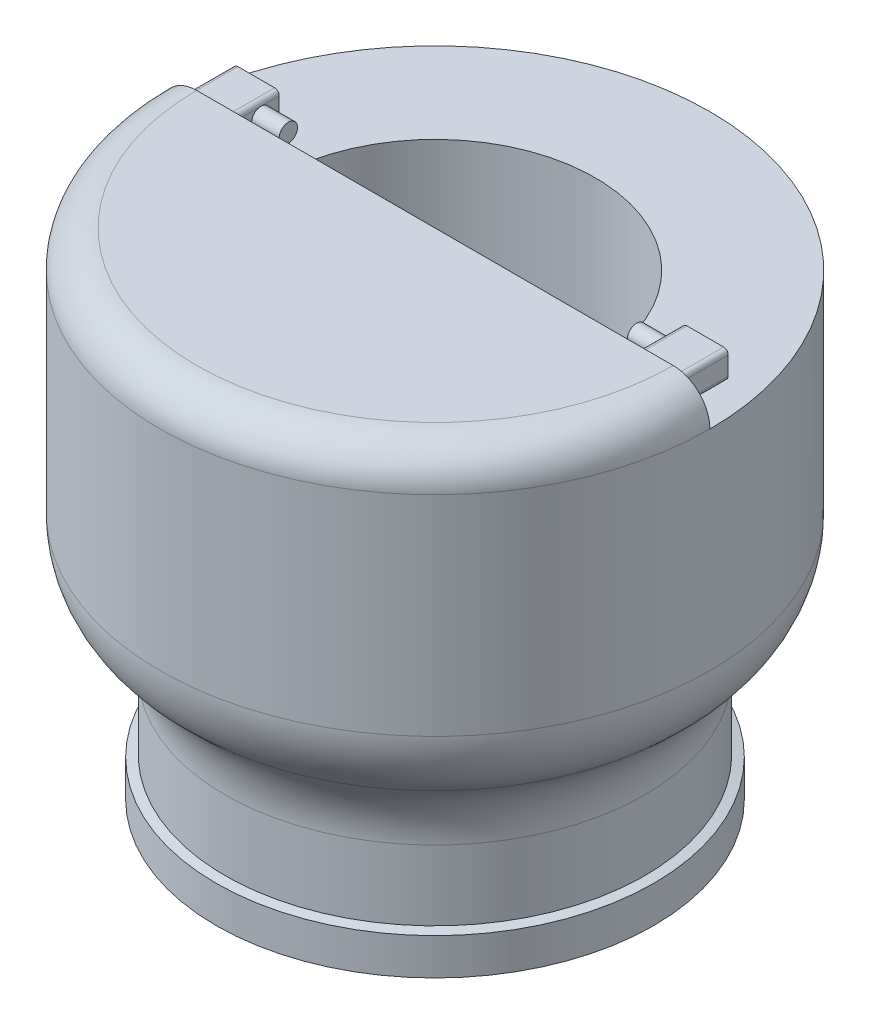
ISO-10303-21;
HEADER;
FILE_DESCRIPTION(('STEP AP214'),'2;1');
FILE_NAME('part.step','',(''),(''),'','','');
FILE_SCHEMA(('AUTOMOTIVE_DESIGN { 1 0 10303 214 1 1 1 1 }'));
ENDSEC;
DATA;
#1=APPLICATION_CONTEXT('core data for automotive mechanical design processes');
#2=APPLICATION_PROTOCOL_DEFINITION('international standard','automotive_design',2000,#1);
#3=PRODUCT_CONTEXT('',#1,'mechanical');
#4=PRODUCT('Part','Part','',(#3));
#5=PRODUCT_RELATED_PRODUCT_CATEGORY('part','',(#4));
#6=PRODUCT_DEFINITION_FORMATION('','',#4);
#7=PRODUCT_DEFINITION_CONTEXT('part definition',#1,'design');
#8=PRODUCT_DEFINITION('design','',#6,#7);
#9=PRODUCT_DEFINITION_SHAPE('','',#8);
#10=(LENGTH_UNIT() NAMED_UNIT(*) SI_UNIT(.MILLI.,.METRE.));
#11=(NAMED_UNIT(*) PLANE_ANGLE_UNIT() SI_UNIT($,.RADIAN.));
#12=(NAMED_UNIT(*) SI_UNIT($,.STERADIAN.) SOLID_ANGLE_UNIT());
#13=UNCERTAINTY_MEASURE_WITH_UNIT(LENGTH_MEASURE(1.E-05),#10,'distance_accuracy_value','');
#14=(GEOMETRIC_REPRESENTATION_CONTEXT(3) GLOBAL_UNCERTAINTY_ASSIGNED_CONTEXT((#13)) GLOBAL_UNIT_ASSIGNED_CONTEXT((#10,
#11,#12)) REPRESENTATION_CONTEXT('',''));
#15=CARTESIAN_POINT('',(0.,0.,0.));
#16=DIRECTION('',(0.,0.,1.));
#17=DIRECTION('',(1.,0.,0.));
#18=AXIS2_PLACEMENT_3D('',#15,#16,#17);
#19=CARTESIAN_POINT('',(-22.,52.9999999999736,-5.));
#20=DIRECTION('',(-1.,0.,0.));
#21=DIRECTION('',(0.,0.,1.));
#22=AXIS2_PLACEMENT_3D('',#19,#20,#21);
#23=PLANE('',#22);
#24=CARTESIAN_POINT('',(-22.,51.9999999999736,-3.));
#25=DIRECTION('',(1.,0.,0.));
#26=DIRECTION('',(0.,0.,-1.));
#27=AXIS2_PLACEMENT_3D('',#24,#25,#26);
#28=CIRCLE('',#27,1.);
#29=CARTESIAN_POINT('',(-22.,50.9999999999736,-3.));
#30=VERTEX_POINT('',#29);
#31=CARTESIAN_POINT('',(-22.,52.9999999999736,-3.));
#32=VERTEX_POINT('',#31);
#33=EDGE_CURVE('E217',#30,#32,#28,.T.);
#34=ORIENTED_EDGE('',*,*,#33,.F.);
#35=DIRECTION('',(0.,0.,1.));
#36=VECTOR('',#35,1.);
#37=CARTESIAN_POINT('',(-22.,50.9999999999736,-5.));
#38=LINE('',#37,#36);
#39=CARTESIAN_POINT('',(-22.,50.9999999999736,-5.));
#40=VERTEX_POINT('',#39);
#41=EDGE_CURVE('E335',#40,#30,#38,.T.);
#42=ORIENTED_EDGE('',*,*,#41,.F.);
#43=DIRECTION('',(0.,-1.,0.));
#44=VECTOR('',#43,1.);
#45=CARTESIAN_POINT('',(-22.,52.9999999999736,-5.));
#46=LINE('',#45,#44);
#47=CARTESIAN_POINT('',(-22.,52.9999999999736,-5.));
#48=VERTEX_POINT('',#47);
#49=EDGE_CURVE('E305',#48,#40,#46,.T.);
#50=ORIENTED_EDGE('',*,*,#49,.F.);
#51=DIRECTION('',(0.,0.,1.));
#52=VECTOR('',#51,1.);
#53=CARTESIAN_POINT('',(-22.,52.9999999999736,-5.));
#54=LINE('',#53,#52);
#55=EDGE_CURVE('E338',#48,#32,#54,.T.);
#56=ORIENTED_EDGE('',*,*,#55,.T.);
#57=EDGE_LOOP('',(#34,#42,#50,#56));
#58=FACE_BOUND('',#57,.T.);
#59=ADVANCED_FACE('F36',(#58),#23,.F.);
#60=CARTESIAN_POINT('',(22.,52.9999999999736,-5.));
#61=DIRECTION('',(1.,0.,0.));
#62=DIRECTION('',(0.,0.,-1.));
#63=AXIS2_PLACEMENT_3D('',#60,#61,#62);
#64=PLANE('',#63);
#65=CARTESIAN_POINT('',(22.,51.9999999999736,-3.));
#66=DIRECTION('',(-1.,0.,0.));
#67=DIRECTION('',(0.,0.,1.));
#68=AXIS2_PLACEMENT_3D('',#65,#66,#67);
#69=CIRCLE('',#68,1.);
#70=CARTESIAN_POINT('',(22.,50.9999999999736,-3.));
#71=VERTEX_POINT('',#70);
#72=CARTESIAN_POINT('',(22.,52.9999999999736,-3.));
#73=VERTEX_POINT('',#72);
#74=EDGE_CURVE('E226',#71,#73,#69,.T.);
#75=ORIENTED_EDGE('',*,*,#74,.F.);
#76=DIRECTION('',(0.,0.,1.));
#77=VECTOR('',#76,1.);
#78=CARTESIAN_POINT('',(22.,50.9999999999736,-5.));
#79=LINE('',#78,#77);
#80=CARTESIAN_POINT('',(22.,50.9999999999736,0.));
#81=VERTEX_POINT('',#80);
#82=EDGE_CURVE('E278',#71,#81,#79,.T.);
#83=ORIENTED_EDGE('',*,*,#82,.T.);
#84=DIRECTION('',(0.,1.,0.));
#85=VECTOR('',#84,1.);
#86=CARTESIAN_POINT('',(22.,52.9999999999736,0.));
#87=LINE('',#86,#85);
#88=CARTESIAN_POINT('',(22.,52.9999999999736,0.));
#89=VERTEX_POINT('',#88);
#90=EDGE_CURVE('E263',#81,#89,#87,.T.);
#91=ORIENTED_EDGE('',*,*,#90,.T.);
#92=DIRECTION('',(0.,0.,1.));
#93=VECTOR('',#92,1.);
#94=CARTESIAN_POINT('',(22.,52.9999999999736,-5.));
#95=LINE('',#94,#93);
#96=EDGE_CURVE('E274',#73,#89,#95,.T.);
#97=ORIENTED_EDGE('',*,*,#96,.F.);
#98=EDGE_LOOP('',(#75,#83,#91,#97));
#99=FACE_BOUND('',#98,.T.);
#100=ADVANCED_FACE('F440',(#99),#64,.F.);
#101=CARTESIAN_POINT('',(-17.5,62.,0.));
#102=DIRECTION('',(0.,0.,-1.));
#103=DIRECTION('',(-1.,0.,0.));
#104=AXIS2_PLACEMENT_3D('',#101,#102,#103);
#105=PLANE('',#104);
#106=DIRECTION('',(0.,-1.,0.));
#107=VECTOR('',#106,1.);
#108=CARTESIAN_POINT('',(-17.5,62.,0.));
#109=LINE('',#108,#107);
#110=CARTESIAN_POINT('',(-17.5,49.9999999999736,0.));
#111=VERTEX_POINT('',#110);
#112=CARTESIAN_POINT('',(-17.5,15.,0.));
#113=VERTEX_POINT('',#112);
#114=EDGE_CURVE('E368',#111,#113,#109,.T.);
#115=ORIENTED_EDGE('',*,*,#114,.F.);
#116=DIRECTION('',(-1.,0.,0.));
#117=VECTOR('',#116,1.);
#118=CARTESIAN_POINT('',(30.,49.9999999999736,0.));
#119=LINE('',#118,#117);
#120=CARTESIAN_POINT('',(-30.,49.9999999999736,0.));
#121=VERTEX_POINT('',#120);
#122=EDGE_CURVE('E355',#111,#121,#119,.T.);
#123=ORIENTED_EDGE('',*,*,#122,.T.);
#124=CARTESIAN_POINT('',(-26.,49.9999999999736,0.));
#125=DIRECTION('',(0.,0.,1.));
#126=DIRECTION('',(1.,0.,0.));
#127=AXIS2_PLACEMENT_3D('',#124,#125,#126);
#128=CIRCLE('',#127,4.);
#129=CARTESIAN_POINT('',(-26.,53.9999999999736,0.));
#130=VERTEX_POINT('',#129);
#131=EDGE_CURVE('E363',#121,#130,#128,.F.);
#132=ORIENTED_EDGE('',*,*,#131,.T.);
#133=DIRECTION('',(-1.,0.,0.));
#134=VECTOR('',#133,1.);
#135=CARTESIAN_POINT('',(26.,53.9999999999736,0.));
#136=LINE('',#135,#134);
#137=CARTESIAN_POINT('',(26.,53.9999999999736,0.));
#138=VERTEX_POINT('',#137);
#139=EDGE_CURVE('E370',#138,#130,#136,.T.);
#140=ORIENTED_EDGE('',*,*,#139,.F.);
#141=CARTESIAN_POINT('',(26.,49.9999999999736,0.));
#142=DIRECTION('',(0.,0.,1.));
#143=DIRECTION('',(1.,0.,0.));
#144=AXIS2_PLACEMENT_3D('',#141,#142,#143);
#145=CIRCLE('',#144,4.);
#146=CARTESIAN_POINT('',(30.,49.9999999999736,0.));
#147=VERTEX_POINT('',#146);
#148=EDGE_CURVE('E361',#138,#147,#145,.F.);
#149=ORIENTED_EDGE('',*,*,#148,.T.);
#150=CARTESIAN_POINT('',(17.5,49.9999999999736,0.));
#151=VERTEX_POINT('',#150);
#152=EDGE_CURVE('E356',#147,#151,#119,.T.);
#153=ORIENTED_EDGE('',*,*,#152,.T.);
#154=DIRECTION('',(0.,-1.,0.));
#155=VECTOR('',#154,1.);
#156=CARTESIAN_POINT('',(17.5,62.,0.));
#157=LINE('',#156,#155);
#158=CARTESIAN_POINT('',(17.5,15.,0.));
#159=VERTEX_POINT('',#158);
#160=EDGE_CURVE('E366',#151,#159,#157,.T.);
#161=ORIENTED_EDGE('',*,*,#160,.T.);
#162=DIRECTION('',(1.,0.,0.));
#163=VECTOR('',#162,1.);
#164=CARTESIAN_POINT('',(19.9,15.,0.));
#165=LINE('',#164,#163);
#166=EDGE_CURVE('E44',#113,#159,#165,.T.);
#167=ORIENTED_EDGE('',*,*,#166,.F.);
#168=EDGE_LOOP('',(#115,#123,#132,#140,#149,#153,#161,#167));
#169=FACE_BOUND('',#168,.T.);
#170=DIRECTION('',(0.,1.,0.));
#171=VECTOR('',#170,1.);
#172=CARTESIAN_POINT('',(-27.,52.9999999999736,0.));
#173=LINE('',#172,#171);
#174=CARTESIAN_POINT('',(-27.,50.9999999999736,0.));
#175=VERTEX_POINT('',#174);
#176=CARTESIAN_POINT('',(-27.,52.9999999999736,0.));
#177=VERTEX_POINT('',#176);
#178=EDGE_CURVE('E314',#175,#177,#173,.T.);
#179=ORIENTED_EDGE('',*,*,#178,.F.);
#180=CARTESIAN_POINT('',(-26.5,50.9999999999736,0.));
#181=DIRECTION('',(0.,0.,-1.));
#182=DIRECTION('',(-1.,0.,0.));
#183=AXIS2_PLACEMENT_3D('',#180,#181,#182);
#184=CIRCLE('',#183,0.5);
#185=CARTESIAN_POINT('',(-26.5,50.4999999999736,0.));
#186=VERTEX_POINT('',#185);
#187=EDGE_CURVE('E292',#186,#175,#184,.T.);
#188=ORIENTED_EDGE('',*,*,#187,.F.);
#189=DIRECTION('',(-1.,0.,0.));
#190=VECTOR('',#189,1.);
#191=CARTESIAN_POINT('',(-22.5,50.4999999999736,0.));
#192=LINE('',#191,#190);
#193=CARTESIAN_POINT('',(-22.5,50.4999999999736,0.));
#194=VERTEX_POINT('',#193);
#195=EDGE_CURVE('E297',#194,#186,#192,.T.);
#196=ORIENTED_EDGE('',*,*,#195,.F.);
#197=CARTESIAN_POINT('',(-22.5,50.9999999999736,0.));
#198=DIRECTION('',(0.,0.,-1.));
#199=DIRECTION('',(-1.,0.,0.));
#200=AXIS2_PLACEMENT_3D('',#197,#198,#199);
#201=CIRCLE('',#200,0.499999999999999);
#202=CARTESIAN_POINT('',(-22.,50.9999999999736,0.));
#203=VERTEX_POINT('',#202);
#204=EDGE_CURVE('E326',#203,#194,#201,.T.);
#205=ORIENTED_EDGE('',*,*,#204,.F.);
#206=DIRECTION('',(0.,-1.,0.));
#207=VECTOR('',#206,1.);
#208=CARTESIAN_POINT('',(-22.,52.9999999999736,0.));
#209=LINE('',#208,#207);
#210=CARTESIAN_POINT('',(-22.,52.9999999999736,0.));
#211=VERTEX_POINT('',#210);
#212=EDGE_CURVE('E323',#211,#203,#209,.T.);
#213=ORIENTED_EDGE('',*,*,#212,.F.);
#214=CARTESIAN_POINT('',(-22.5,52.9999999999736,0.));
#215=DIRECTION('',(0.,0.,-1.));
#216=DIRECTION('',(-1.,0.,0.));
#217=AXIS2_PLACEMENT_3D('',#214,#215,#216);
#218=CIRCLE('',#217,0.499999999999999);
#219=CARTESIAN_POINT('',(-22.5,53.4999999999736,0.));
#220=VERTEX_POINT('',#219);
#221=EDGE_CURVE('E320',#220,#211,#218,.T.);
#222=ORIENTED_EDGE('',*,*,#221,.F.);
#223=DIRECTION('',(1.,0.,0.));
#224=VECTOR('',#223,1.);
#225=CARTESIAN_POINT('',(-22.5,53.4999999999736,0.));
#226=LINE('',#225,#224);
#227=CARTESIAN_POINT('',(-26.5,53.4999999999736,0.));
#228=VERTEX_POINT('',#227);
#229=EDGE_CURVE('E318',#228,#220,#226,.T.);
#230=ORIENTED_EDGE('',*,*,#229,.F.);
#231=CARTESIAN_POINT('',(-26.5,52.9999999999736,0.));
#232=DIRECTION('',(0.,0.,-1.));
#233=DIRECTION('',(-1.,0.,0.));
#234=AXIS2_PLACEMENT_3D('',#231,#232,#233);
#235=CIRCLE('',#234,0.5);
#236=EDGE_CURVE('E316',#177,#228,#235,.T.);
#237=ORIENTED_EDGE('',*,*,#236,.F.);
#238=EDGE_LOOP('',(#179,#188,#196,#205,#213,#222,#230,#237));
#239=FACE_BOUND('',#238,.T.);
#240=DIRECTION('',(0.,-1.,0.));
#241=VECTOR('',#240,1.);
#242=CARTESIAN_POINT('',(27.,52.9999999999736,0.));
#243=LINE('',#242,#241);
#244=CARTESIAN_POINT('',(27.,52.9999999999736,0.));
#245=VERTEX_POINT('',#244);
#246=CARTESIAN_POINT('',(27.,50.9999999999736,0.));
#247=VERTEX_POINT('',#246);
#248=EDGE_CURVE('E254',#245,#247,#243,.T.);
#249=ORIENTED_EDGE('',*,*,#248,.F.);
#250=CARTESIAN_POINT('',(26.5,52.9999999999736,0.));
#251=DIRECTION('',(0.,0.,-1.));
#252=DIRECTION('',(-1.,0.,0.));
#253=AXIS2_PLACEMENT_3D('',#250,#251,#252);
#254=CIRCLE('',#253,0.5);
#255=CARTESIAN_POINT('',(26.5,53.4999999999736,0.));
#256=VERTEX_POINT('',#255);
#257=EDGE_CURVE('E231',#256,#245,#254,.T.);
#258=ORIENTED_EDGE('',*,*,#257,.F.);
#259=DIRECTION('',(1.,0.,0.));
#260=VECTOR('',#259,1.);
#261=CARTESIAN_POINT('',(26.5,53.4999999999736,0.));
#262=LINE('',#261,#260);
#263=CARTESIAN_POINT('',(22.5,53.4999999999736,0.));
#264=VERTEX_POINT('',#263);
#265=EDGE_CURVE('E237',#264,#256,#262,.T.);
#266=ORIENTED_EDGE('',*,*,#265,.F.);
#267=CARTESIAN_POINT('',(22.5,52.9999999999736,0.));
#268=DIRECTION('',(0.,0.,-1.));
#269=DIRECTION('',(1.,0.,0.));
#270=AXIS2_PLACEMENT_3D('',#267,#268,#269);
#271=CIRCLE('',#270,0.5);
#272=EDGE_CURVE('E266',#89,#264,#271,.T.);
#273=ORIENTED_EDGE('',*,*,#272,.F.);
#274=ORIENTED_EDGE('',*,*,#90,.F.);
#275=CARTESIAN_POINT('',(22.5,50.9999999999736,0.));
#276=DIRECTION('',(0.,0.,-1.));
#277=DIRECTION('',(-1.,0.,0.));
#278=AXIS2_PLACEMENT_3D('',#275,#276,#277);
#279=CIRCLE('',#278,0.5);
#280=CARTESIAN_POINT('',(22.5,50.4999999999736,0.));
#281=VERTEX_POINT('',#280);
#282=EDGE_CURVE('E260',#281,#81,#279,.T.);
#283=ORIENTED_EDGE('',*,*,#282,.F.);
#284=DIRECTION('',(-1.,0.,0.));
#285=VECTOR('',#284,1.);
#286=CARTESIAN_POINT('',(26.5,50.4999999999736,0.));
#287=LINE('',#286,#285);
#288=CARTESIAN_POINT('',(26.5,50.4999999999736,0.));
#289=VERTEX_POINT('',#288);
#290=EDGE_CURVE('E258',#289,#281,#287,.T.);
#291=ORIENTED_EDGE('',*,*,#290,.F.);
#292=CARTESIAN_POINT('',(26.5,50.9999999999736,0.));
#293=DIRECTION('',(0.,0.,-1.));
#294=DIRECTION('',(-1.,0.,0.));
#295=AXIS2_PLACEMENT_3D('',#292,#293,#294);
#296=CIRCLE('',#295,0.5);
#297=EDGE_CURVE('E256',#247,#289,#296,.T.);
#298=ORIENTED_EDGE('',*,*,#297,.F.);
#299=EDGE_LOOP('',(#249,#258,#266,#273,#274,#283,#291,#298));
#300=FACE_BOUND('',#299,.T.);
#301=ADVANCED_FACE('F414',(#169,#239,#300),#105,.T.);
#302=CARTESIAN_POINT('',(26.,53.9999999999736,0.));
#303=DIRECTION('',(0.,1.,0.));
#304=DIRECTION('',(0.,0.,1.));
#305=AXIS2_PLACEMENT_3D('',#302,#303,#304);
#306=PLANE('',#305);
#307=ORIENTED_EDGE('',*,*,#139,.T.);
#308=CARTESIAN_POINT('',(0.,53.9999999999736,0.));
#309=DIRECTION('',(0.,-1.,0.));
#310=DIRECTION('',(0.,0.,-1.));
#311=AXIS2_PLACEMENT_3D('',#308,#309,#310);
#312=CIRCLE('',#311,26.);
#313=EDGE_CURVE('E378',#138,#130,#312,.T.);
#314=ORIENTED_EDGE('',*,*,#313,.F.);
#315=EDGE_LOOP('',(#307,#314));
#316=FACE_BOUND('',#315,.T.);
#317=ADVANCED_FACE('F431',(#316),#306,.T.);
#318=CARTESIAN_POINT('',(19.9,15.,0.));
#319=DIRECTION('',(0.,-1.,0.));
#320=DIRECTION('',(0.,0.,-1.));
#321=AXIS2_PLACEMENT_3D('',#318,#319,#320);
#322=PLANE('',#321);
#323=CARTESIAN_POINT('',(0.,15.,0.));
#324=DIRECTION('',(0.,-1.,0.));
#325=DIRECTION('',(0.,0.,-1.));
#326=AXIS2_PLACEMENT_3D('',#323,#324,#325);
#327=CIRCLE('',#326,19.9);
#328=CARTESIAN_POINT('',(0.,15.,-19.9));
#329=VERTEX_POINT('',#328);
#330=EDGE_CURVE('E375',#329,#329,#327,.T.);
#331=ORIENTED_EDGE('',*,*,#330,.T.);
#332=EDGE_LOOP('',(#331));
#333=FACE_BOUND('',#332,.T.);
#334=ORIENTED_EDGE('',*,*,#166,.T.);
#335=CARTESIAN_POINT('',(0.,15.,0.));
#336=DIRECTION('',(0.,-1.,0.));
#337=DIRECTION('',(0.,0.,-1.));
#338=AXIS2_PLACEMENT_3D('',#335,#336,#337);
#339=CIRCLE('',#338,17.5);
#340=EDGE_CURVE('E11',#159,#113,#339,.F.);
#341=ORIENTED_EDGE('',*,*,#340,.T.);
#342=EDGE_LOOP('',(#334,#341));
#343=FACE_BOUND('',#342,.T.);
#344=ADVANCED_FACE('F410',(#333,#343),#322,.T.);
#345=CARTESIAN_POINT('',(0.,0.,0.));
#346=DIRECTION('',(0.,-1.,0.));
#347=DIRECTION('',(0.,0.,-1.));
#348=AXIS2_PLACEMENT_3D('',#345,#346,#347);
#349=CYLINDRICAL_SURFACE('',#348,20.9);
#350=CARTESIAN_POINT('',(0.,0.,0.));
#351=DIRECTION('',(0.,-1.,0.));
#352=DIRECTION('',(0.,0.,-1.));
#353=AXIS2_PLACEMENT_3D('',#350,#351,#352);
#354=CIRCLE('',#353,20.9);
#355=CARTESIAN_POINT('',(0.,0.,-20.9));
#356=VERTEX_POINT('',#355);
#357=EDGE_CURVE('E405',#356,#356,#354,.T.);
#358=ORIENTED_EDGE('',*,*,#357,.T.);
#359=EDGE_LOOP('',(#358));
#360=FACE_BOUND('',#359,.T.);
#361=CARTESIAN_POINT('',(0.,14.,0.));
#362=DIRECTION('',(0.,-1.,0.));
#363=DIRECTION('',(0.,0.,-1.));
#364=AXIS2_PLACEMENT_3D('',#361,#362,#363);
#365=CIRCLE('',#364,20.9);
#366=CARTESIAN_POINT('',(0.,14.,-20.9));
#367=VERTEX_POINT('',#366);
#368=EDGE_CURVE('E372',#367,#367,#365,.T.);
#369=ORIENTED_EDGE('',*,*,#368,.F.);
#370=EDGE_LOOP('',(#369));
#371=FACE_BOUND('',#370,.T.);
#372=ADVANCED_FACE('F38',(#360,#371),#349,.F.);
#373=CARTESIAN_POINT('',(20.9,0.,0.));
#374=DIRECTION('',(0.,-1.,0.));
#375=DIRECTION('',(0.,0.,-1.));
#376=AXIS2_PLACEMENT_3D('',#373,#374,#375);
#377=PLANE('',#376);
#378=CARTESIAN_POINT('',(0.,0.,0.));
#379=DIRECTION('',(0.,-1.,0.));
#380=DIRECTION('',(0.,0.,-1.));
#381=AXIS2_PLACEMENT_3D('',#378,#379,#380);
#382=CIRCLE('',#381,23.8715918375041);
#383=CARTESIAN_POINT('',(0.,0.,-23.8715918375041));
#384=VERTEX_POINT('',#383);
#385=EDGE_CURVE('E402',#384,#384,#382,.T.);
#386=ORIENTED_EDGE('',*,*,#385,.T.);
#387=EDGE_LOOP('',(#386));
#388=FACE_BOUND('',#387,.T.);
#389=ORIENTED_EDGE('',*,*,#357,.F.);
#390=EDGE_LOOP('',(#389));
#391=FACE_BOUND('',#390,.T.);
#392=ADVANCED_FACE('F501',(#388,#391),#377,.T.);
#393=CARTESIAN_POINT('',(0.,0.,0.));
#394=DIRECTION('',(0.,-1.,0.));
#395=DIRECTION('',(0.,0.,-1.));
#396=AXIS2_PLACEMENT_3D('',#393,#394,#395);
#397=CYLINDRICAL_SURFACE('',#396,23.8715918375041);
#398=CARTESIAN_POINT('',(0.,4.,0.));
#399=DIRECTION('',(0.,-1.,0.));
#400=DIRECTION('',(0.,0.,-1.));
#401=AXIS2_PLACEMENT_3D('',#398,#399,#400);
#402=CIRCLE('',#401,23.8715918375041);
#403=CARTESIAN_POINT('',(0.,4.,-23.8715918375041));
#404=VERTEX_POINT('',#403);
#405=EDGE_CURVE('E399',#404,#404,#402,.T.);
#406=ORIENTED_EDGE('',*,*,#405,.T.);
#407=EDGE_LOOP('',(#406));
#408=FACE_BOUND('',#407,.T.);
#409=ORIENTED_EDGE('',*,*,#385,.F.);
#410=EDGE_LOOP('',(#409));
#411=FACE_BOUND('',#410,.T.);
#412=ADVANCED_FACE('F506',(#408,#411),#397,.T.);
#413=CARTESIAN_POINT('',(0.,4.,0.));
#414=DIRECTION('',(0.,-1.,0.));
#415=DIRECTION('',(0.,0.,-1.));
#416=AXIS2_PLACEMENT_3D('',#413,#414,#415);
#417=CONICAL_SURFACE('',#416,23.8715918375041,1.33186665186768);
#418=CARTESIAN_POINT('',(0.,4.23666284308145,0.));
#419=DIRECTION('',(0.,-1.,0.));
#420=DIRECTION('',(0.,0.,-1.));
#421=AXIS2_PLACEMENT_3D('',#418,#419,#420);
#422=CIRCLE('',#421,22.9);
#423=CARTESIAN_POINT('',(0.,4.23666284308145,-22.9));
#424=VERTEX_POINT('',#423);
#425=EDGE_CURVE('E396',#424,#424,#422,.T.);
#426=ORIENTED_EDGE('',*,*,#425,.T.);
#427=EDGE_LOOP('',(#426));
#428=FACE_BOUND('',#427,.T.);
#429=ORIENTED_EDGE('',*,*,#405,.F.);
#430=EDGE_LOOP('',(#429));
#431=FACE_BOUND('',#430,.T.);
#432=ADVANCED_FACE('F513',(#428,#431),#417,.T.);
#433=CARTESIAN_POINT('',(0.,0.,0.));
#434=DIRECTION('',(0.,-1.,0.));
#435=DIRECTION('',(0.,0.,-1.));
#436=AXIS2_PLACEMENT_3D('',#433,#434,#435);
#437=CYLINDRICAL_SURFACE('',#436,22.9);
#438=CARTESIAN_POINT('',(0.,11.8745768176467,0.));
#439=DIRECTION('',(0.,-1.,0.));
#440=DIRECTION('',(0.,0.,-1.));
#441=AXIS2_PLACEMENT_3D('',#438,#439,#440);
#442=CIRCLE('',#441,22.9);
#443=CARTESIAN_POINT('',(0.,11.8745768176467,-22.9));
#444=VERTEX_POINT('',#443);
#445=EDGE_CURVE('E393',#444,#444,#442,.T.);
#446=ORIENTED_EDGE('',*,*,#445,.T.);
#447=EDGE_LOOP('',(#446));
#448=FACE_BOUND('',#447,.T.);
#449=ORIENTED_EDGE('',*,*,#425,.F.);
#450=EDGE_LOOP('',(#449));
#451=FACE_BOUND('',#450,.T.);
#452=ADVANCED_FACE('F519',(#448,#451),#437,.T.);
#453=CARTESIAN_POINT('',(0.,11.8745768176467,0.));
#454=DIRECTION('',(0.,-1.,0.));
#455=DIRECTION('',(0.,0.,-1.));
#456=AXIS2_PLACEMENT_3D('',#453,#454,#455);
#457=TOROIDAL_SURFACE('',#456,32.9,10.);
#458=CARTESIAN_POINT('',(0.,19.5350212488365,0.));
#459=DIRECTION('',(0.,-1.,0.));
#460=DIRECTION('',(0.,0.,-1.));
#461=AXIS2_PLACEMENT_3D('',#458,#459,#460);
#462=CIRCLE('',#461,26.4721239031347);
#463=CARTESIAN_POINT('',(0.,19.5350212488365,-26.4721239031347));
#464=VERTEX_POINT('',#463);
#465=EDGE_CURVE('E390',#464,#464,#462,.T.);
#466=ORIENTED_EDGE('',*,*,#465,.T.);
#467=EDGE_LOOP('',(#466));
#468=FACE_BOUND('',#467,.T.);
#469=ORIENTED_EDGE('',*,*,#445,.F.);
#470=EDGE_LOOP('',(#469));
#471=FACE_BOUND('',#470,.T.);
#472=ADVANCED_FACE('F523',(#468,#471),#457,.F.);
#473=CARTESIAN_POINT('',(0.,19.5350212488365,0.));
#474=DIRECTION('',(0.,1.,0.));
#475=DIRECTION('',(0.,0.,1.));
#476=AXIS2_PLACEMENT_3D('',#473,#474,#475);
#477=CONICAL_SURFACE('',#476,26.4721239031347,0.872664625997203);
#478=CARTESIAN_POINT('',(0.,19.4978929309156,0.));
#479=DIRECTION('',(0.,-1.,0.));
#480=DIRECTION('',(0.,0.,-1.));
#481=AXIS2_PLACEMENT_3D('',#478,#479,#480);
#482=CIRCLE('',#481,26.4278760968653);
#483=CARTESIAN_POINT('',(0.,19.4978929309156,-26.4278760968653));
#484=VERTEX_POINT('',#483);
#485=EDGE_CURVE('E387',#484,#484,#482,.T.);
#486=ORIENTED_EDGE('',*,*,#485,.T.);
#487=EDGE_LOOP('',(#486));
#488=FACE_BOUND('',#487,.T.);
#489=ORIENTED_EDGE('',*,*,#465,.F.);
#490=EDGE_LOOP('',(#489));
#491=FACE_BOUND('',#490,.T.);
#492=ADVANCED_FACE('F527',(#488,#491),#477,.F.);
#493=CARTESIAN_POINT('',(0.,27.1583373621054,0.));
#494=DIRECTION('',(0.,-1.,0.));
#495=DIRECTION('',(0.,0.,-1.));
#496=AXIS2_PLACEMENT_3D('',#493,#494,#495);
#497=TOROIDAL_SURFACE('',#496,20.,10.);
#498=CARTESIAN_POINT('',(0.,27.1583373621054,0.));
#499=DIRECTION('',(0.,-1.,0.));
#500=DIRECTION('',(0.,0.,-1.));
#501=AXIS2_PLACEMENT_3D('',#498,#499,#500);
#502=CIRCLE('',#501,30.);
#503=CARTESIAN_POINT('',(0.,27.1583373621054,-30.));
#504=VERTEX_POINT('',#503);
#505=EDGE_CURVE('E384',#504,#504,#502,.T.);
#506=ORIENTED_EDGE('',*,*,#505,.T.);
#507=EDGE_LOOP('',(#506));
#508=FACE_BOUND('',#507,.T.);
#509=ORIENTED_EDGE('',*,*,#485,.F.);
#510=EDGE_LOOP('',(#509));
#511=FACE_BOUND('',#510,.T.);
#512=ADVANCED_FACE('F531',(#508,#511),#497,.T.);
#513=CARTESIAN_POINT('',(0.,0.,0.));
#514=DIRECTION('',(0.,-1.,0.));
#515=DIRECTION('',(0.,0.,-1.));
#516=AXIS2_PLACEMENT_3D('',#513,#514,#515);
#517=CYLINDRICAL_SURFACE('',#516,30.);
#518=CARTESIAN_POINT('',(0.,49.9999999999736,0.));
#519=DIRECTION('',(0.,-1.,0.));
#520=DIRECTION('',(0.,0.,-1.));
#521=AXIS2_PLACEMENT_3D('',#518,#519,#520);
#522=CIRCLE('',#521,30.);
#523=EDGE_CURVE('E381',#147,#121,#522,.T.);
#524=ORIENTED_EDGE('',*,*,#523,.T.);
#525=CARTESIAN_POINT('',(0.,49.9999999999736,0.));
#526=DIRECTION('',(0.,-1.,0.));
#527=DIRECTION('',(0.,0.,-1.));
#528=AXIS2_PLACEMENT_3D('',#525,#526,#527);
#529=CIRCLE('',#528,30.);
#530=EDGE_CURVE('E352',#121,#147,#529,.T.);
#531=ORIENTED_EDGE('',*,*,#530,.T.);
#532=EDGE_LOOP('',(#524,#531));
#533=FACE_BOUND('',#532,.T.);
#534=ORIENTED_EDGE('',*,*,#505,.F.);
#535=EDGE_LOOP('',(#534));
#536=FACE_BOUND('',#535,.T.);
#537=ADVANCED_FACE('F495',(#533,#536),#517,.T.);
#538=CARTESIAN_POINT('',(0.,49.9999999999736,0.));
#539=DIRECTION('',(0.,-1.,0.));
#540=DIRECTION('',(0.,0.,-1.));
#541=AXIS2_PLACEMENT_3D('',#538,#539,#540);
#542=TOROIDAL_SURFACE('',#541,26.,4.);
#543=ORIENTED_EDGE('',*,*,#131,.F.);
#544=ORIENTED_EDGE('',*,*,#523,.F.);
#545=ORIENTED_EDGE('',*,*,#148,.F.);
#546=ORIENTED_EDGE('',*,*,#313,.T.);
#547=EDGE_LOOP('',(#543,#544,#545,#546));
#548=FACE_BOUND('',#547,.T.);
#549=ADVANCED_FACE('F429',(#548),#542,.T.);
#550=CARTESIAN_POINT('',(0.,14.,0.));
#551=DIRECTION('',(0.,-1.,0.));
#552=DIRECTION('',(0.,0.,-1.));
#553=AXIS2_PLACEMENT_3D('',#550,#551,#552);
#554=TOROIDAL_SURFACE('',#553,19.9,1.);
#555=ORIENTED_EDGE('',*,*,#368,.T.);
#556=EDGE_LOOP('',(#555));
#557=FACE_BOUND('',#556,.T.);
#558=ORIENTED_EDGE('',*,*,#330,.F.);
#559=EDGE_LOOP('',(#558));
#560=FACE_BOUND('',#559,.T.);
#561=ADVANCED_FACE('F489',(#557,#560),#554,.F.);
#562=CARTESIAN_POINT('',(0.,62.,0.));
#563=DIRECTION('',(0.,-1.,0.));
#564=DIRECTION('',(1.,0.,0.));
#565=AXIS2_PLACEMENT_3D('',#562,#563,#564);
#566=CYLINDRICAL_SURFACE('',#565,17.5);
#567=CARTESIAN_POINT('',(0.,49.9999999999736,0.));
#568=DIRECTION('',(0.,-1.,0.));
#569=DIRECTION('',(0.,0.,-1.));
#570=AXIS2_PLACEMENT_3D('',#567,#568,#569);
#571=CIRCLE('',#570,17.5);
#572=EDGE_CURVE('E359',#111,#151,#571,.T.);
#573=ORIENTED_EDGE('',*,*,#572,.F.);
#574=ORIENTED_EDGE('',*,*,#114,.T.);
#575=ORIENTED_EDGE('',*,*,#340,.F.);
#576=ORIENTED_EDGE('',*,*,#160,.F.);
#577=EDGE_LOOP('',(#573,#574,#575,#576));
#578=FACE_BOUND('',#577,.T.);
#579=ADVANCED_FACE('F420',(#578),#566,.F.);
#580=CARTESIAN_POINT('',(0.,49.9999999999736,0.));
#581=DIRECTION('',(0.,-1.,0.));
#582=DIRECTION('',(0.,0.,-1.));
#583=AXIS2_PLACEMENT_3D('',#580,#581,#582);
#584=PLANE('',#583);
#585=ORIENTED_EDGE('',*,*,#572,.T.);
#586=ORIENTED_EDGE('',*,*,#152,.F.);
#587=ORIENTED_EDGE('',*,*,#530,.F.);
#588=ORIENTED_EDGE('',*,*,#122,.F.);
#589=EDGE_LOOP('',(#585,#586,#587,#588));
#590=FACE_BOUND('',#589,.T.);
#591=ADVANCED_FACE('F422',(#590),#584,.F.);
#592=CARTESIAN_POINT('',(-26.5,50.9999999999736,-5.));
#593=DIRECTION('',(0.,0.,1.));
#594=DIRECTION('',(1.,0.,0.));
#595=AXIS2_PLACEMENT_3D('',#592,#593,#594);
#596=CYLINDRICAL_SURFACE('',#595,0.5);
#597=ORIENTED_EDGE('',*,*,#187,.T.);
#598=DIRECTION('',(0.,0.,1.));
#599=VECTOR('',#598,1.);
#600=CARTESIAN_POINT('',(-27.,50.9999999999736,-5.));
#601=LINE('',#600,#599);
#602=CARTESIAN_POINT('',(-27.,50.9999999999736,-5.));
#603=VERTEX_POINT('',#602);
#604=EDGE_CURVE('E350',#603,#175,#601,.T.);
#605=ORIENTED_EDGE('',*,*,#604,.F.);
#606=CARTESIAN_POINT('',(-26.5,50.9999999999736,-5.));
#607=DIRECTION('',(0.,0.,-1.));
#608=DIRECTION('',(-1.,0.,0.));
#609=AXIS2_PLACEMENT_3D('',#606,#607,#608);
#610=CIRCLE('',#609,0.5);
#611=CARTESIAN_POINT('',(-26.5,50.4999999999736,-5.));
#612=VERTEX_POINT('',#611);
#613=EDGE_CURVE('E293',#612,#603,#610,.T.);
#614=ORIENTED_EDGE('',*,*,#613,.F.);
#615=DIRECTION('',(0.,0.,1.));
#616=VECTOR('',#615,1.);
#617=CARTESIAN_POINT('',(-26.5,50.4999999999736,-5.));
#618=LINE('',#617,#616);
#619=EDGE_CURVE('E311',#612,#186,#618,.T.);
#620=ORIENTED_EDGE('',*,*,#619,.T.);
#621=EDGE_LOOP('',(#597,#605,#614,#620));
#622=FACE_BOUND('',#621,.T.);
#623=ADVANCED_FACE('F480',(#622),#596,.T.);
#624=CARTESIAN_POINT('',(-27.,52.9999999999736,-5.));
#625=DIRECTION('',(1.,0.,0.));
#626=DIRECTION('',(0.,0.,-1.));
#627=AXIS2_PLACEMENT_3D('',#624,#625,#626);
#628=PLANE('',#627);
#629=ORIENTED_EDGE('',*,*,#178,.T.);
#630=DIRECTION('',(0.,0.,1.));
#631=VECTOR('',#630,1.);
#632=CARTESIAN_POINT('',(-27.,52.9999999999736,-5.));
#633=LINE('',#632,#631);
#634=CARTESIAN_POINT('',(-27.,52.9999999999736,-5.));
#635=VERTEX_POINT('',#634);
#636=EDGE_CURVE('E347',#635,#177,#633,.T.);
#637=ORIENTED_EDGE('',*,*,#636,.F.);
#638=DIRECTION('',(0.,1.,0.));
#639=VECTOR('',#638,1.);
#640=CARTESIAN_POINT('',(-27.,52.9999999999736,-5.));
#641=LINE('',#640,#639);
#642=EDGE_CURVE('E296',#603,#635,#641,.T.);
#643=ORIENTED_EDGE('',*,*,#642,.F.);
#644=ORIENTED_EDGE('',*,*,#604,.T.);
#645=EDGE_LOOP('',(#629,#637,#643,#644));
#646=FACE_BOUND('',#645,.T.);
#647=ADVANCED_FACE('F476',(#646),#628,.F.);
#648=CARTESIAN_POINT('',(-26.5,52.9999999999736,-5.));
#649=DIRECTION('',(0.,0.,1.));
#650=DIRECTION('',(1.,0.,0.));
#651=AXIS2_PLACEMENT_3D('',#648,#649,#650);
#652=CYLINDRICAL_SURFACE('',#651,0.5);
#653=ORIENTED_EDGE('',*,*,#236,.T.);
#654=DIRECTION('',(0.,0.,1.));
#655=VECTOR('',#654,1.);
#656=CARTESIAN_POINT('',(-26.5,53.4999999999736,-5.));
#657=LINE('',#656,#655);
#658=CARTESIAN_POINT('',(-26.5,53.4999999999736,-5.));
#659=VERTEX_POINT('',#658);
#660=EDGE_CURVE('E344',#659,#228,#657,.T.);
#661=ORIENTED_EDGE('',*,*,#660,.F.);
#662=CARTESIAN_POINT('',(-26.5,52.9999999999736,-5.));
#663=DIRECTION('',(0.,0.,-1.));
#664=DIRECTION('',(-1.,0.,0.));
#665=AXIS2_PLACEMENT_3D('',#662,#663,#664);
#666=CIRCLE('',#665,0.5);
#667=EDGE_CURVE('E299',#635,#659,#666,.T.);
#668=ORIENTED_EDGE('',*,*,#667,.F.);
#669=ORIENTED_EDGE('',*,*,#636,.T.);
#670=EDGE_LOOP('',(#653,#661,#668,#669));
#671=FACE_BOUND('',#670,.T.);
#672=ADVANCED_FACE('F470',(#671),#652,.T.);
#673=CARTESIAN_POINT('',(-22.5,53.4999999999736,-5.));
#674=DIRECTION('',(0.,-1.,0.));
#675=DIRECTION('',(0.,0.,-1.));
#676=AXIS2_PLACEMENT_3D('',#673,#674,#675);
#677=PLANE('',#676);
#678=ORIENTED_EDGE('',*,*,#229,.T.);
#679=DIRECTION('',(0.,0.,1.));
#680=VECTOR('',#679,1.);
#681=CARTESIAN_POINT('',(-22.5,53.4999999999736,-5.));
#682=LINE('',#681,#680);
#683=CARTESIAN_POINT('',(-22.5,53.4999999999736,-5.));
#684=VERTEX_POINT('',#683);
#685=EDGE_CURVE('E341',#684,#220,#682,.T.);
#686=ORIENTED_EDGE('',*,*,#685,.F.);
#687=DIRECTION('',(1.,0.,0.));
#688=VECTOR('',#687,1.);
#689=CARTESIAN_POINT('',(-22.5,53.4999999999736,-5.));
#690=LINE('',#689,#688);
#691=EDGE_CURVE('E301',#659,#684,#690,.T.);
#692=ORIENTED_EDGE('',*,*,#691,.F.);
#693=ORIENTED_EDGE('',*,*,#660,.T.);
#694=EDGE_LOOP('',(#678,#686,#692,#693));
#695=FACE_BOUND('',#694,.T.);
#696=ADVANCED_FACE('F465',(#695),#677,.F.);
#697=CARTESIAN_POINT('',(-22.5,52.9999999999736,-5.));
#698=DIRECTION('',(0.,0.,1.));
#699=DIRECTION('',(1.,0.,0.));
#700=AXIS2_PLACEMENT_3D('',#697,#698,#699);
#701=CYLINDRICAL_SURFACE('',#700,0.499999999999999);
#702=ORIENTED_EDGE('',*,*,#221,.T.);
#703=EDGE_CURVE('E337',#32,#211,#54,.T.);
#704=ORIENTED_EDGE('',*,*,#703,.F.);
#705=ORIENTED_EDGE('',*,*,#55,.F.);
#706=CARTESIAN_POINT('',(-22.5,52.9999999999736,-5.));
#707=DIRECTION('',(0.,0.,-1.));
#708=DIRECTION('',(-1.,0.,0.));
#709=AXIS2_PLACEMENT_3D('',#706,#707,#708);
#710=CIRCLE('',#709,0.499999999999999);
#711=EDGE_CURVE('E303',#684,#48,#710,.T.);
#712=ORIENTED_EDGE('',*,*,#711,.F.);
#713=ORIENTED_EDGE('',*,*,#685,.T.);
#714=EDGE_LOOP('',(#702,#704,#705,#712,#713));
#715=FACE_BOUND('',#714,.T.);
#716=ADVANCED_FACE('F458',(#715),#701,.T.);
#717=EDGE_CURVE('E51',#32,#30,#28,.T.);
#718=ORIENTED_EDGE('',*,*,#717,.F.);
#719=ORIENTED_EDGE('',*,*,#703,.T.);
#720=ORIENTED_EDGE('',*,*,#212,.T.);
#721=EDGE_CURVE('E334',#30,#203,#38,.T.);
#722=ORIENTED_EDGE('',*,*,#721,.F.);
#723=EDGE_LOOP('',(#718,#719,#720,#722));
#724=FACE_BOUND('',#723,.T.);
#725=ADVANCED_FACE('F446',(#724),#23,.F.);
#726=CARTESIAN_POINT('',(-22.5,50.9999999999736,-5.));
#727=DIRECTION('',(0.,0.,1.));
#728=DIRECTION('',(1.,0.,0.));
#729=AXIS2_PLACEMENT_3D('',#726,#727,#728);
#730=CYLINDRICAL_SURFACE('',#729,0.499999999999999);
#731=ORIENTED_EDGE('',*,*,#204,.T.);
#732=DIRECTION('',(0.,0.,1.));
#733=VECTOR('',#732,1.);
#734=CARTESIAN_POINT('',(-22.5,50.4999999999736,-5.));
#735=LINE('',#734,#733);
#736=CARTESIAN_POINT('',(-22.5,50.4999999999736,-5.));
#737=VERTEX_POINT('',#736);
#738=EDGE_CURVE('E332',#737,#194,#735,.T.);
#739=ORIENTED_EDGE('',*,*,#738,.F.);
#740=CARTESIAN_POINT('',(-22.5,50.9999999999736,-5.));
#741=DIRECTION('',(0.,0.,-1.));
#742=DIRECTION('',(-1.,0.,0.));
#743=AXIS2_PLACEMENT_3D('',#740,#741,#742);
#744=CIRCLE('',#743,0.499999999999999);
#745=EDGE_CURVE('E307',#40,#737,#744,.T.);
#746=ORIENTED_EDGE('',*,*,#745,.F.);
#747=ORIENTED_EDGE('',*,*,#41,.T.);
#748=ORIENTED_EDGE('',*,*,#721,.T.);
#749=EDGE_LOOP('',(#731,#739,#746,#747,#748));
#750=FACE_BOUND('',#749,.T.);
#751=ADVANCED_FACE('F457',(#750),#730,.T.);
#752=CARTESIAN_POINT('',(-22.5,50.4999999999736,-5.));
#753=DIRECTION('',(0.,1.,0.));
#754=DIRECTION('',(0.,0.,1.));
#755=AXIS2_PLACEMENT_3D('',#752,#753,#754);
#756=PLANE('',#755);
#757=ORIENTED_EDGE('',*,*,#195,.T.);
#758=ORIENTED_EDGE('',*,*,#619,.F.);
#759=DIRECTION('',(-1.,0.,0.));
#760=VECTOR('',#759,1.);
#761=CARTESIAN_POINT('',(-22.5,50.4999999999736,-5.));
#762=LINE('',#761,#760);
#763=EDGE_CURVE('E309',#737,#612,#762,.T.);
#764=ORIENTED_EDGE('',*,*,#763,.F.);
#765=ORIENTED_EDGE('',*,*,#738,.T.);
#766=EDGE_LOOP('',(#757,#758,#764,#765));
#767=FACE_BOUND('',#766,.T.);
#768=ADVANCED_FACE('F463',(#767),#756,.F.);
#769=CARTESIAN_POINT('',(-26.5,50.9999999999736,-5.));
#770=DIRECTION('',(0.,0.,-1.));
#771=DIRECTION('',(-1.,0.,0.));
#772=AXIS2_PLACEMENT_3D('',#769,#770,#771);
#773=PLANE('',#772);
#774=ORIENTED_EDGE('',*,*,#613,.T.);
#775=ORIENTED_EDGE('',*,*,#642,.T.);
#776=ORIENTED_EDGE('',*,*,#667,.T.);
#777=ORIENTED_EDGE('',*,*,#691,.T.);
#778=ORIENTED_EDGE('',*,*,#711,.T.);
#779=ORIENTED_EDGE('',*,*,#49,.T.);
#780=ORIENTED_EDGE('',*,*,#745,.T.);
#781=ORIENTED_EDGE('',*,*,#763,.T.);
#782=EDGE_LOOP('',(#774,#775,#776,#777,#778,#779,#780,#781));
#783=FACE_BOUND('',#782,.T.);
#784=ADVANCED_FACE('F615',(#783),#773,.T.);
#785=CARTESIAN_POINT('',(26.5,52.9999999999736,-5.));
#786=DIRECTION('',(0.,0.,1.));
#787=DIRECTION('',(1.,0.,0.));
#788=AXIS2_PLACEMENT_3D('',#785,#786,#787);
#789=CYLINDRICAL_SURFACE('',#788,0.5);
#790=ORIENTED_EDGE('',*,*,#257,.T.);
#791=DIRECTION('',(0.,0.,1.));
#792=VECTOR('',#791,1.);
#793=CARTESIAN_POINT('',(27.,52.9999999999736,-5.));
#794=LINE('',#793,#792);
#795=CARTESIAN_POINT('',(27.,52.9999999999736,-5.));
#796=VERTEX_POINT('',#795);
#797=EDGE_CURVE('E290',#796,#245,#794,.T.);
#798=ORIENTED_EDGE('',*,*,#797,.F.);
#799=CARTESIAN_POINT('',(26.5,52.9999999999736,-5.));
#800=DIRECTION('',(0.,0.,-1.));
#801=DIRECTION('',(-1.,0.,0.));
#802=AXIS2_PLACEMENT_3D('',#799,#800,#801);
#803=CIRCLE('',#802,0.5);
#804=CARTESIAN_POINT('',(26.5,53.4999999999736,-5.));
#805=VERTEX_POINT('',#804);
#806=EDGE_CURVE('E233',#805,#796,#803,.T.);
#807=ORIENTED_EDGE('',*,*,#806,.F.);
#808=DIRECTION('',(0.,0.,1.));
#809=VECTOR('',#808,1.);
#810=CARTESIAN_POINT('',(26.5,53.4999999999736,-5.));
#811=LINE('',#810,#809);
#812=EDGE_CURVE('E251',#805,#256,#811,.T.);
#813=ORIENTED_EDGE('',*,*,#812,.T.);
#814=EDGE_LOOP('',(#790,#798,#807,#813));
#815=FACE_BOUND('',#814,.T.);
#816=ADVANCED_FACE('F626',(#815),#789,.T.);
#817=CARTESIAN_POINT('',(27.,52.9999999999736,-5.));
#818=DIRECTION('',(-1.,0.,0.));
#819=DIRECTION('',(0.,0.,1.));
#820=AXIS2_PLACEMENT_3D('',#817,#818,#819);
#821=PLANE('',#820);
#822=ORIENTED_EDGE('',*,*,#248,.T.);
#823=DIRECTION('',(0.,0.,1.));
#824=VECTOR('',#823,1.);
#825=CARTESIAN_POINT('',(27.,50.9999999999736,-5.));
#826=LINE('',#825,#824);
#827=CARTESIAN_POINT('',(27.,50.9999999999736,-5.));
#828=VERTEX_POINT('',#827);
#829=EDGE_CURVE('E287',#828,#247,#826,.T.);
#830=ORIENTED_EDGE('',*,*,#829,.F.);
#831=DIRECTION('',(0.,-1.,0.));
#832=VECTOR('',#831,1.);
#833=CARTESIAN_POINT('',(27.,52.9999999999736,-5.));
#834=LINE('',#833,#832);
#835=EDGE_CURVE('E236',#796,#828,#834,.T.);
#836=ORIENTED_EDGE('',*,*,#835,.F.);
#837=ORIENTED_EDGE('',*,*,#797,.T.);
#838=EDGE_LOOP('',(#822,#830,#836,#837));
#839=FACE_BOUND('',#838,.T.);
#840=ADVANCED_FACE('F636',(#839),#821,.F.);
#841=CARTESIAN_POINT('',(26.5,50.9999999999736,-5.));
#842=DIRECTION('',(0.,0.,1.));
#843=DIRECTION('',(1.,0.,0.));
#844=AXIS2_PLACEMENT_3D('',#841,#842,#843);
#845=CYLINDRICAL_SURFACE('',#844,0.5);
#846=ORIENTED_EDGE('',*,*,#297,.T.);
#847=DIRECTION('',(0.,0.,1.));
#848=VECTOR('',#847,1.);
#849=CARTESIAN_POINT('',(26.5,50.4999999999736,-5.));
#850=LINE('',#849,#848);
#851=CARTESIAN_POINT('',(26.5,50.4999999999736,-5.));
#852=VERTEX_POINT('',#851);
#853=EDGE_CURVE('E284',#852,#289,#850,.T.);
#854=ORIENTED_EDGE('',*,*,#853,.F.);
#855=CARTESIAN_POINT('',(26.5,50.9999999999736,-5.));
#856=DIRECTION('',(0.,0.,-1.));
#857=DIRECTION('',(-1.,0.,0.));
#858=AXIS2_PLACEMENT_3D('',#855,#856,#857);
#859=CIRCLE('',#858,0.5);
#860=EDGE_CURVE('E239',#828,#852,#859,.T.);
#861=ORIENTED_EDGE('',*,*,#860,.F.);
#862=ORIENTED_EDGE('',*,*,#829,.T.);
#863=EDGE_LOOP('',(#846,#854,#861,#862));
#864=FACE_BOUND('',#863,.T.);
#865=ADVANCED_FACE('F646',(#864),#845,.T.);
#866=CARTESIAN_POINT('',(26.5,50.4999999999736,-5.));
#867=DIRECTION('',(0.,1.,0.));
#868=DIRECTION('',(0.,0.,1.));
#869=AXIS2_PLACEMENT_3D('',#866,#867,#868);
#870=PLANE('',#869);
#871=ORIENTED_EDGE('',*,*,#290,.T.);
#872=DIRECTION('',(0.,0.,1.));
#873=VECTOR('',#872,1.);
#874=CARTESIAN_POINT('',(22.5,50.4999999999736,-5.));
#875=LINE('',#874,#873);
#876=CARTESIAN_POINT('',(22.5,50.4999999999736,-5.));
#877=VERTEX_POINT('',#876);
#878=EDGE_CURVE('E281',#877,#281,#875,.T.);
#879=ORIENTED_EDGE('',*,*,#878,.F.);
#880=DIRECTION('',(-1.,0.,0.));
#881=VECTOR('',#880,1.);
#882=CARTESIAN_POINT('',(26.5,50.4999999999736,-5.));
#883=LINE('',#882,#881);
#884=EDGE_CURVE('E241',#852,#877,#883,.T.);
#885=ORIENTED_EDGE('',*,*,#884,.F.);
#886=ORIENTED_EDGE('',*,*,#853,.T.);
#887=EDGE_LOOP('',(#871,#879,#885,#886));
#888=FACE_BOUND('',#887,.T.);
#889=ADVANCED_FACE('F656',(#888),#870,.F.);
#890=CARTESIAN_POINT('',(22.5,50.9999999999736,-5.));
#891=DIRECTION('',(0.,0.,1.));
#892=DIRECTION('',(1.,0.,0.));
#893=AXIS2_PLACEMENT_3D('',#890,#891,#892);
#894=CYLINDRICAL_SURFACE('',#893,0.5);
#895=ORIENTED_EDGE('',*,*,#282,.T.);
#896=ORIENTED_EDGE('',*,*,#82,.F.);
#897=CARTESIAN_POINT('',(22.,50.9999999999736,-5.));
#898=VERTEX_POINT('',#897);
#899=EDGE_CURVE('E279',#898,#71,#79,.T.);
#900=ORIENTED_EDGE('',*,*,#899,.F.);
#901=CARTESIAN_POINT('',(22.5,50.9999999999736,-5.));
#902=DIRECTION('',(0.,0.,-1.));
#903=DIRECTION('',(-1.,0.,0.));
#904=AXIS2_PLACEMENT_3D('',#901,#902,#903);
#905=CIRCLE('',#904,0.5);
#906=EDGE_CURVE('E243',#877,#898,#905,.T.);
#907=ORIENTED_EDGE('',*,*,#906,.F.);
#908=ORIENTED_EDGE('',*,*,#878,.T.);
#909=EDGE_LOOP('',(#895,#896,#900,#907,#908));
#910=FACE_BOUND('',#909,.T.);
#911=ADVANCED_FACE('F666',(#910),#894,.T.);
#912=EDGE_CURVE('E59',#73,#71,#69,.T.);
#913=ORIENTED_EDGE('',*,*,#912,.F.);
#914=CARTESIAN_POINT('',(22.,52.9999999999736,-5.));
#915=VERTEX_POINT('',#914);
#916=EDGE_CURVE('E275',#915,#73,#95,.T.);
#917=ORIENTED_EDGE('',*,*,#916,.F.);
#918=DIRECTION('',(0.,1.,0.));
#919=VECTOR('',#918,1.);
#920=CARTESIAN_POINT('',(22.,52.9999999999736,-5.));
#921=LINE('',#920,#919);
#922=EDGE_CURVE('E245',#898,#915,#921,.T.);
#923=ORIENTED_EDGE('',*,*,#922,.F.);
#924=ORIENTED_EDGE('',*,*,#899,.T.);
#925=EDGE_LOOP('',(#913,#917,#923,#924));
#926=FACE_BOUND('',#925,.T.);
#927=ADVANCED_FACE('F452',(#926),#64,.F.);
#928=CARTESIAN_POINT('',(22.5,52.9999999999736,-5.));
#929=DIRECTION('',(0.,0.,1.));
#930=DIRECTION('',(1.,0.,0.));
#931=AXIS2_PLACEMENT_3D('',#928,#929,#930);
#932=CYLINDRICAL_SURFACE('',#931,0.5);
#933=ORIENTED_EDGE('',*,*,#272,.T.);
#934=DIRECTION('',(0.,0.,1.));
#935=VECTOR('',#934,1.);
#936=CARTESIAN_POINT('',(22.5,53.4999999999736,-5.));
#937=LINE('',#936,#935);
#938=CARTESIAN_POINT('',(22.5,53.4999999999736,-5.));
#939=VERTEX_POINT('',#938);
#940=EDGE_CURVE('E272',#939,#264,#937,.T.);
#941=ORIENTED_EDGE('',*,*,#940,.F.);
#942=CARTESIAN_POINT('',(22.5,52.9999999999736,-5.));
#943=DIRECTION('',(0.,0.,-1.));
#944=DIRECTION('',(1.,0.,0.));
#945=AXIS2_PLACEMENT_3D('',#942,#943,#944);
#946=CIRCLE('',#945,0.5);
#947=EDGE_CURVE('E247',#915,#939,#946,.T.);
#948=ORIENTED_EDGE('',*,*,#947,.F.);
#949=ORIENTED_EDGE('',*,*,#916,.T.);
#950=ORIENTED_EDGE('',*,*,#96,.T.);
#951=EDGE_LOOP('',(#933,#941,#948,#949,#950));
#952=FACE_BOUND('',#951,.T.);
#953=ADVANCED_FACE('F680',(#952),#932,.T.);
#954=CARTESIAN_POINT('',(26.5,53.4999999999736,-5.));
#955=DIRECTION('',(0.,-1.,0.));
#956=DIRECTION('',(0.,0.,-1.));
#957=AXIS2_PLACEMENT_3D('',#954,#955,#956);
#958=PLANE('',#957);
#959=ORIENTED_EDGE('',*,*,#265,.T.);
#960=ORIENTED_EDGE('',*,*,#812,.F.);
#961=DIRECTION('',(1.,0.,0.));
#962=VECTOR('',#961,1.);
#963=CARTESIAN_POINT('',(26.5,53.4999999999736,-5.));
#964=LINE('',#963,#962);
#965=EDGE_CURVE('E249',#939,#805,#964,.T.);
#966=ORIENTED_EDGE('',*,*,#965,.F.);
#967=ORIENTED_EDGE('',*,*,#940,.T.);
#968=EDGE_LOOP('',(#959,#960,#966,#967));
#969=FACE_BOUND('',#968,.T.);
#970=ADVANCED_FACE('F674',(#969),#958,.F.);
#971=CARTESIAN_POINT('',(26.5,52.9999999999736,-5.));
#972=DIRECTION('',(0.,0.,-1.));
#973=DIRECTION('',(-1.,0.,0.));
#974=AXIS2_PLACEMENT_3D('',#971,#972,#973);
#975=PLANE('',#974);
#976=ORIENTED_EDGE('',*,*,#806,.T.);
#977=ORIENTED_EDGE('',*,*,#835,.T.);
#978=ORIENTED_EDGE('',*,*,#860,.T.);
#979=ORIENTED_EDGE('',*,*,#884,.T.);
#980=ORIENTED_EDGE('',*,*,#906,.T.);
#981=ORIENTED_EDGE('',*,*,#922,.T.);
#982=ORIENTED_EDGE('',*,*,#947,.T.);
#983=ORIENTED_EDGE('',*,*,#965,.T.);
#984=EDGE_LOOP('',(#976,#977,#978,#979,#980,#981,#982,#983));
#985=FACE_BOUND('',#984,.T.);
#986=ADVANCED_FACE('F679',(#985),#975,.T.);
#987=CARTESIAN_POINT('',(19.,51.9999999999736,-3.));
#988=DIRECTION('',(1.,0.,0.));
#989=DIRECTION('',(0.,0.,-1.));
#990=AXIS2_PLACEMENT_3D('',#987,#988,#989);
#991=CYLINDRICAL_SURFACE('',#990,1.);
#992=CARTESIAN_POINT('',(19.,51.9999999999736,-3.));
#993=DIRECTION('',(-1.,0.,0.));
#994=DIRECTION('',(0.,0.,1.));
#995=AXIS2_PLACEMENT_3D('',#992,#993,#994);
#996=CIRCLE('',#995,1.);
#997=CARTESIAN_POINT('',(19.,51.9999999999736,-2.));
#998=VERTEX_POINT('',#997);
#999=EDGE_CURVE('E228',#998,#998,#996,.T.);
#1000=ORIENTED_EDGE('',*,*,#999,.F.);
#1001=EDGE_LOOP('',(#1000));
#1002=FACE_BOUND('',#1001,.T.);
#1003=ORIENTED_EDGE('',*,*,#912,.T.);
#1004=ORIENTED_EDGE('',*,*,#74,.T.);
#1005=EDGE_LOOP('',(#1003,#1004));
#1006=FACE_BOUND('',#1005,.T.);
#1007=ADVANCED_FACE('F692',(#1002,#1006),#991,.T.);
#1008=CARTESIAN_POINT('',(19.,51.9999999999736,-3.));
#1009=DIRECTION('',(-1.,0.,0.));
#1010=DIRECTION('',(0.,0.,1.));
#1011=AXIS2_PLACEMENT_3D('',#1008,#1009,#1010);
#1012=PLANE('',#1011);
#1013=ORIENTED_EDGE('',*,*,#999,.T.);
#1014=EDGE_LOOP('',(#1013));
#1015=FACE_BOUND('',#1014,.T.);
#1016=ADVANCED_FACE('F729',(#1015),#1012,.T.);
#1017=CARTESIAN_POINT('',(-19.,51.9999999999736,-3.));
#1018=DIRECTION('',(-1.,0.,0.));
#1019=DIRECTION('',(0.,0.,1.));
#1020=AXIS2_PLACEMENT_3D('',#1017,#1018,#1019);
#1021=CYLINDRICAL_SURFACE('',#1020,1.);
#1022=CARTESIAN_POINT('',(-19.,51.9999999999736,-3.));
#1023=DIRECTION('',(1.,0.,0.));
#1024=DIRECTION('',(0.,0.,-1.));
#1025=AXIS2_PLACEMENT_3D('',#1022,#1023,#1024);
#1026=CIRCLE('',#1025,1.);
#1027=CARTESIAN_POINT('',(-19.,51.9999999999736,-4.));
#1028=VERTEX_POINT('',#1027);
#1029=EDGE_CURVE('E224',#1028,#1028,#1026,.T.);
#1030=ORIENTED_EDGE('',*,*,#1029,.F.);
#1031=EDGE_LOOP('',(#1030));
#1032=FACE_BOUND('',#1031,.T.);
#1033=ORIENTED_EDGE('',*,*,#717,.T.);
#1034=ORIENTED_EDGE('',*,*,#33,.T.);
#1035=EDGE_LOOP('',(#1033,#1034));
#1036=FACE_BOUND('',#1035,.T.);
#1037=ADVANCED_FACE('F738',(#1032,#1036),#1021,.T.);
#1038=CARTESIAN_POINT('',(-19.,51.9999999999736,-3.));
#1039=DIRECTION('',(1.,0.,0.));
#1040=DIRECTION('',(0.,0.,-1.));
#1041=AXIS2_PLACEMENT_3D('',#1038,#1039,#1040);
#1042=PLANE('',#1041);
#1043=ORIENTED_EDGE('',*,*,#1029,.T.);
#1044=EDGE_LOOP('',(#1043));
#1045=FACE_BOUND('',#1044,.T.);
#1046=ADVANCED_FACE('F765',(#1045),#1042,.T.);
#1047=CLOSED_SHELL('',(#59,#100,#301,#317,#344,#372,#392,#412,#432,#452,#472,#492,#512,#537,
#549,#561,#579,#591,#623,#647,#672,#696,#716,#725,#751,#768,#784,#816,#840,#865,#889,#911,#927,
#953,#970,#986,#1007,#1016,#1037,#1046));
#1048=CARTESIAN_POINT('',(0.,27.9999999999736,0.));
#1049=DIRECTION('',(0.,1.,0.));
#1050=DIRECTION('',(0.,0.,1.));
#1051=AXIS2_PLACEMENT_3D('',#1048,#1049,#1050);
#1052=CYLINDRICAL_SURFACE('',#1051,28.75);
#1053=CARTESIAN_POINT('',(0.,49.9999999999736,0.));
#1054=DIRECTION('',(0.,-1.,0.));
#1055=DIRECTION('',(0.,0.,-1.));
#1056=AXIS2_PLACEMENT_3D('',#1053,#1054,#1055);
#1057=CIRCLE('',#1056,28.75);
#1058=CARTESIAN_POINT('',(28.4703793441535,49.9999999999736,4.));
#1059=VERTEX_POINT('',#1058);
#1060=CARTESIAN_POINT('',(-28.4703793441535,49.9999999999736,4.));
#1061=VERTEX_POINT('',#1060);
#1062=EDGE_CURVE('E815',#1059,#1061,#1057,.T.);
#1063=ORIENTED_EDGE('',*,*,#1062,.F.);
#1064=DIRECTION('',(0.,1.,0.));
#1065=VECTOR('',#1064,1.);
#1066=CARTESIAN_POINT('',(28.4703793441535,27.9999999999736,4.));
#1067=LINE('',#1066,#1065);
#1068=CARTESIAN_POINT('',(28.4703793441535,27.9999999999736,4.));
#1069=VERTEX_POINT('',#1068);
#1070=EDGE_CURVE('E206',#1069,#1059,#1067,.T.);
#1071=ORIENTED_EDGE('',*,*,#1070,.F.);
#1072=CARTESIAN_POINT('',(0.,27.9999999999736,0.));
#1073=DIRECTION('',(0.,-1.,0.));
#1074=DIRECTION('',(0.,0.,-1.));
#1075=AXIS2_PLACEMENT_3D('',#1072,#1073,#1074);
#1076=CIRCLE('',#1075,28.75);
#1077=CARTESIAN_POINT('',(-28.4703793441535,27.9999999999736,4.));
#1078=VERTEX_POINT('',#1077);
#1079=EDGE_CURVE('E201',#1069,#1078,#1076,.T.);
#1080=ORIENTED_EDGE('',*,*,#1079,.T.);
#1081=DIRECTION('',(0.,1.,0.));
#1082=VECTOR('',#1081,1.);
#1083=CARTESIAN_POINT('',(-28.4703793441535,27.9999999999736,4.));
#1084=LINE('',#1083,#1082);
#1085=EDGE_CURVE('E212',#1078,#1061,#1084,.T.);
#1086=ORIENTED_EDGE('',*,*,#1085,.T.);
#1087=EDGE_LOOP('',(#1063,#1071,#1080,#1086));
#1088=FACE_BOUND('',#1087,.T.);
#1089=ADVANCED_FACE('F211',(#1088),#1052,.F.);
#1090=CARTESIAN_POINT('',(-28.4703793441535,27.9999999999736,4.));
#1091=DIRECTION('',(0.,0.,1.));
#1092=DIRECTION('',(1.,0.,0.));
#1093=AXIS2_PLACEMENT_3D('',#1090,#1091,#1092);
#1094=PLANE('',#1093);
#1095=DIRECTION('',(1.,0.,0.));
#1096=VECTOR('',#1095,1.);
#1097=CARTESIAN_POINT('',(-28.4703793441535,49.9999999999736,4.));
#1098=LINE('',#1097,#1096);
#1099=EDGE_CURVE('E214',#1061,#1059,#1098,.T.);
#1100=ORIENTED_EDGE('',*,*,#1099,.F.);
#1101=ORIENTED_EDGE('',*,*,#1085,.F.);
#1102=DIRECTION('',(1.,0.,0.));
#1103=VECTOR('',#1102,1.);
#1104=CARTESIAN_POINT('',(-28.4703793441535,27.9999999999736,4.));
#1105=LINE('',#1104,#1103);
#1106=EDGE_CURVE('E198',#1078,#1069,#1105,.T.);
#1107=ORIENTED_EDGE('',*,*,#1106,.T.);
#1108=ORIENTED_EDGE('',*,*,#1070,.T.);
#1109=EDGE_LOOP('',(#1100,#1101,#1107,#1108));
#1110=FACE_BOUND('',#1109,.T.);
#1111=ADVANCED_FACE('F216',(#1110),#1094,.T.);
#1112=CARTESIAN_POINT('',(0.,27.9999999999736,0.));
#1113=DIRECTION('',(0.,-1.,0.));
#1114=DIRECTION('',(0.,0.,-1.));
#1115=AXIS2_PLACEMENT_3D('',#1112,#1113,#1114);
#1116=PLANE('',#1115);
#1117=ORIENTED_EDGE('',*,*,#1079,.F.);
#1118=ORIENTED_EDGE('',*,*,#1106,.F.);
#1119=EDGE_LOOP('',(#1117,#1118));
#1120=FACE_BOUND('',#1119,.T.);
#1121=ADVANCED_FACE('F200',(#1120),#1116,.F.);
#1122=CARTESIAN_POINT('',(0.,49.9999999999736,0.));
#1123=DIRECTION('',(0.,-1.,0.));
#1124=DIRECTION('',(0.,0.,-1.));
#1125=AXIS2_PLACEMENT_3D('',#1122,#1123,#1124);
#1126=PLANE('',#1125);
#1127=ORIENTED_EDGE('',*,*,#1062,.T.);
#1128=ORIENTED_EDGE('',*,*,#1099,.T.);
#1129=EDGE_LOOP('',(#1127,#1128));
#1130=FACE_BOUND('',#1129,.T.);
#1131=ADVANCED_FACE('F801',(#1130),#1126,.T.);
#1132=CLOSED_SHELL('',(#1089,#1111,#1121,#1131));
#1133=ORIENTED_CLOSED_SHELL('',*,#1132,.T.);
#1134=BREP_WITH_VOIDS('B2',#1047,(#1133));
#1135=ADVANCED_BREP_SHAPE_REPRESENTATION('',(#18,#1134),#14);
#1136=SHAPE_DEFINITION_REPRESENTATION(#9,#1135);
ENDSEC;
END-ISO-10303-21;
